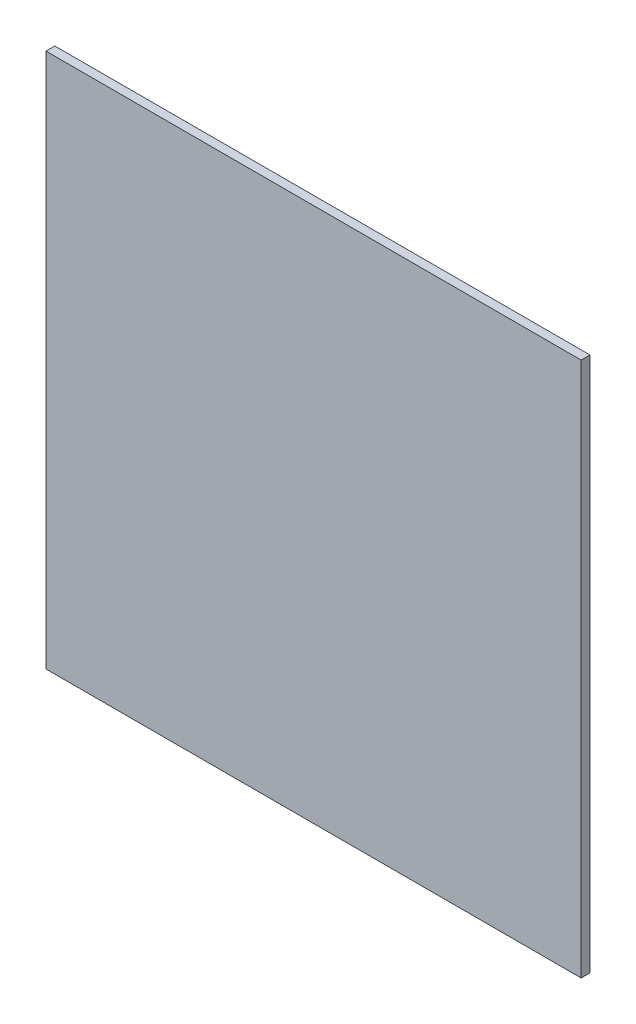
ISO-10303-21;
HEADER;
FILE_DESCRIPTION(('STEP AP214'),'2;1');
FILE_NAME('part.step','',(''),(''),'','','');
FILE_SCHEMA(('AUTOMOTIVE_DESIGN { 1 0 10303 214 1 1 1 1 }'));
ENDSEC;
DATA;
#1=APPLICATION_CONTEXT('core data for automotive mechanical design processes');
#2=APPLICATION_PROTOCOL_DEFINITION('international standard','automotive_design',2000,#1);
#3=PRODUCT_CONTEXT('',#1,'mechanical');
#4=PRODUCT('Part','Part','',(#3));
#5=PRODUCT_RELATED_PRODUCT_CATEGORY('part','',(#4));
#6=PRODUCT_DEFINITION_FORMATION('','',#4);
#7=PRODUCT_DEFINITION_CONTEXT('part definition',#1,'design');
#8=PRODUCT_DEFINITION('design','',#6,#7);
#9=PRODUCT_DEFINITION_SHAPE('','',#8);
#10=(LENGTH_UNIT() NAMED_UNIT(*) SI_UNIT(.MILLI.,.METRE.));
#11=(NAMED_UNIT(*) PLANE_ANGLE_UNIT() SI_UNIT($,.RADIAN.));
#12=(NAMED_UNIT(*) SI_UNIT($,.STERADIAN.) SOLID_ANGLE_UNIT());
#13=UNCERTAINTY_MEASURE_WITH_UNIT(LENGTH_MEASURE(1.E-05),#10,'distance_accuracy_value','');
#14=(GEOMETRIC_REPRESENTATION_CONTEXT(3) GLOBAL_UNCERTAINTY_ASSIGNED_CONTEXT((#13)) GLOBAL_UNIT_ASSIGNED_CONTEXT((#10,
#11,#12)) REPRESENTATION_CONTEXT('',''));
#15=CARTESIAN_POINT('',(0.,0.,0.));
#16=DIRECTION('',(0.,0.,1.));
#17=DIRECTION('',(1.,0.,0.));
#18=AXIS2_PLACEMENT_3D('',#15,#16,#17);
#19=CARTESIAN_POINT('',(-256.013393359467,60.5,50.));
#20=DIRECTION('',(0.,1.,0.));
#21=DIRECTION('',(0.,0.,1.));
#22=AXIS2_PLACEMENT_3D('',#19,#20,#21);
#23=PLANE('',#22);
#24=DIRECTION('',(1.,0.,0.));
#25=VECTOR('',#24,1.);
#26=CARTESIAN_POINT('',(0.,60.5,48.));
#27=LINE('',#26,#25);
#28=CARTESIAN_POINT('',(-60.5,60.5,48.));
#29=VERTEX_POINT('',#28);
#30=CARTESIAN_POINT('',(60.5,60.5,48.));
#31=VERTEX_POINT('',#30);
#32=EDGE_CURVE('E37',#29,#31,#27,.T.);
#33=ORIENTED_EDGE('',*,*,#32,.F.);
#34=DIRECTION('',(0.,0.,1.));
#35=VECTOR('',#34,1.);
#36=CARTESIAN_POINT('',(-60.5,60.5,-133.832293437024));
#37=LINE('',#36,#35);
#38=CARTESIAN_POINT('',(-60.5,60.5,50.));
#39=VERTEX_POINT('',#38);
#40=EDGE_CURVE('E99',#29,#39,#37,.T.);
#41=ORIENTED_EDGE('',*,*,#40,.T.);
#42=DIRECTION('',(1.,0.,0.));
#43=VECTOR('',#42,1.);
#44=CARTESIAN_POINT('',(-62.5,60.5,50.));
#45=LINE('',#44,#43);
#46=CARTESIAN_POINT('',(60.5,60.5,50.));
#47=VERTEX_POINT('',#46);
#48=EDGE_CURVE('E88',#39,#47,#45,.T.);
#49=ORIENTED_EDGE('',*,*,#48,.T.);
#50=DIRECTION('',(0.,0.,-1.));
#51=VECTOR('',#50,1.);
#52=CARTESIAN_POINT('',(60.5,60.5,-133.832293437024));
#53=LINE('',#52,#51);
#54=EDGE_CURVE('E87',#47,#31,#53,.T.);
#55=ORIENTED_EDGE('',*,*,#54,.T.);
#56=EDGE_LOOP('',(#33,#41,#49,#55));
#57=FACE_BOUND('',#56,.T.);
#58=ADVANCED_FACE('F33',(#57),#23,.T.);
#59=CARTESIAN_POINT('',(-301.446567486664,-60.5,50.));
#60=DIRECTION('',(0.,-1.,0.));
#61=DIRECTION('',(0.,0.,-1.));
#62=AXIS2_PLACEMENT_3D('',#59,#60,#61);
#63=PLANE('',#62);
#64=DIRECTION('',(0.,0.,-1.));
#65=VECTOR('',#64,1.);
#66=CARTESIAN_POINT('',(-60.5,-60.5,-133.832293437024));
#67=LINE('',#66,#65);
#68=CARTESIAN_POINT('',(-60.5,-60.5,50.));
#69=VERTEX_POINT('',#68);
#70=CARTESIAN_POINT('',(-60.5,-60.5,48.));
#71=VERTEX_POINT('',#70);
#72=EDGE_CURVE('E93',#69,#71,#67,.T.);
#73=ORIENTED_EDGE('',*,*,#72,.T.);
#74=DIRECTION('',(1.,0.,0.));
#75=VECTOR('',#74,1.);
#76=CARTESIAN_POINT('',(0.,-60.5,48.));
#77=LINE('',#76,#75);
#78=CARTESIAN_POINT('',(60.5,-60.5,48.));
#79=VERTEX_POINT('',#78);
#80=EDGE_CURVE('E76',#71,#79,#77,.T.);
#81=ORIENTED_EDGE('',*,*,#80,.T.);
#82=DIRECTION('',(0.,0.,1.));
#83=VECTOR('',#82,1.);
#84=CARTESIAN_POINT('',(60.5,-60.5,-133.832293437024));
#85=LINE('',#84,#83);
#86=CARTESIAN_POINT('',(60.5,-60.5,50.));
#87=VERTEX_POINT('',#86);
#88=EDGE_CURVE('E82',#79,#87,#85,.T.);
#89=ORIENTED_EDGE('',*,*,#88,.T.);
#90=DIRECTION('',(-1.,0.,0.));
#91=VECTOR('',#90,1.);
#92=CARTESIAN_POINT('',(-62.5,-60.5,50.));
#93=LINE('',#92,#91);
#94=EDGE_CURVE('E94',#87,#69,#93,.T.);
#95=ORIENTED_EDGE('',*,*,#94,.T.);
#96=EDGE_LOOP('',(#73,#81,#89,#95));
#97=FACE_BOUND('',#96,.T.);
#98=ADVANCED_FACE('F91',(#97),#63,.T.);
#99=CARTESIAN_POINT('',(60.5,62.5,-133.832293437024));
#100=DIRECTION('',(-1.,0.,0.));
#101=DIRECTION('',(0.,0.,1.));
#102=AXIS2_PLACEMENT_3D('',#99,#100,#101);
#103=PLANE('',#102);
#104=ORIENTED_EDGE('',*,*,#54,.F.);
#105=DIRECTION('',(0.,1.,0.));
#106=VECTOR('',#105,1.);
#107=CARTESIAN_POINT('',(60.5,62.5,50.));
#108=LINE('',#107,#106);
#109=EDGE_CURVE('E79',#87,#47,#108,.T.);
#110=ORIENTED_EDGE('',*,*,#109,.F.);
#111=ORIENTED_EDGE('',*,*,#88,.F.);
#112=DIRECTION('',(0.,-1.,0.));
#113=VECTOR('',#112,1.);
#114=CARTESIAN_POINT('',(60.5,62.5,48.));
#115=LINE('',#114,#113);
#116=EDGE_CURVE('E72',#31,#79,#115,.T.);
#117=ORIENTED_EDGE('',*,*,#116,.F.);
#118=EDGE_LOOP('',(#104,#110,#111,#117));
#119=FACE_BOUND('',#118,.T.);
#120=ADVANCED_FACE('F83',(#119),#103,.F.);
#121=CARTESIAN_POINT('',(-60.5,62.5,-133.832293437024));
#122=DIRECTION('',(1.,0.,0.));
#123=DIRECTION('',(0.,0.,-1.));
#124=AXIS2_PLACEMENT_3D('',#121,#122,#123);
#125=PLANE('',#124);
#126=ORIENTED_EDGE('',*,*,#40,.F.);
#127=DIRECTION('',(0.,-1.,0.));
#128=VECTOR('',#127,1.);
#129=CARTESIAN_POINT('',(-60.5,62.5,48.));
#130=LINE('',#129,#128);
#131=EDGE_CURVE('E11',#29,#71,#130,.T.);
#132=ORIENTED_EDGE('',*,*,#131,.T.);
#133=ORIENTED_EDGE('',*,*,#72,.F.);
#134=DIRECTION('',(0.,-1.,0.));
#135=VECTOR('',#134,1.);
#136=CARTESIAN_POINT('',(-60.5,62.5,50.));
#137=LINE('',#136,#135);
#138=EDGE_CURVE('E42',#39,#69,#137,.T.);
#139=ORIENTED_EDGE('',*,*,#138,.F.);
#140=EDGE_LOOP('',(#126,#132,#133,#139));
#141=FACE_BOUND('',#140,.T.);
#142=ADVANCED_FACE('F107',(#141),#125,.F.);
#143=CARTESIAN_POINT('',(-62.5,62.5,50.));
#144=DIRECTION('',(0.,0.,-1.));
#145=DIRECTION('',(-1.,0.,0.));
#146=AXIS2_PLACEMENT_3D('',#143,#144,#145);
#147=PLANE('',#146);
#148=ORIENTED_EDGE('',*,*,#48,.F.);
#149=ORIENTED_EDGE('',*,*,#138,.T.);
#150=ORIENTED_EDGE('',*,*,#94,.F.);
#151=ORIENTED_EDGE('',*,*,#109,.T.);
#152=EDGE_LOOP('',(#148,#149,#150,#151));
#153=FACE_BOUND('',#152,.T.);
#154=ADVANCED_FACE('F35',(#153),#147,.F.);
#155=CARTESIAN_POINT('',(-62.5,62.5,48.));
#156=DIRECTION('',(0.,0.,-1.));
#157=DIRECTION('',(-1.,0.,0.));
#158=AXIS2_PLACEMENT_3D('',#155,#156,#157);
#159=PLANE('',#158);
#160=ORIENTED_EDGE('',*,*,#80,.F.);
#161=ORIENTED_EDGE('',*,*,#131,.F.);
#162=ORIENTED_EDGE('',*,*,#32,.T.);
#163=ORIENTED_EDGE('',*,*,#116,.T.);
#164=EDGE_LOOP('',(#160,#161,#162,#163));
#165=FACE_BOUND('',#164,.T.);
#166=ADVANCED_FACE('F74',(#165),#159,.T.);
#167=CLOSED_SHELL('',(#58,#98,#120,#142,#154,#166));
#168=MANIFOLD_SOLID_BREP('B2',#167);
#169=ADVANCED_BREP_SHAPE_REPRESENTATION('',(#18,#168),#14);
#170=SHAPE_DEFINITION_REPRESENTATION(#9,#169);
ENDSEC;
END-ISO-10303-21;
